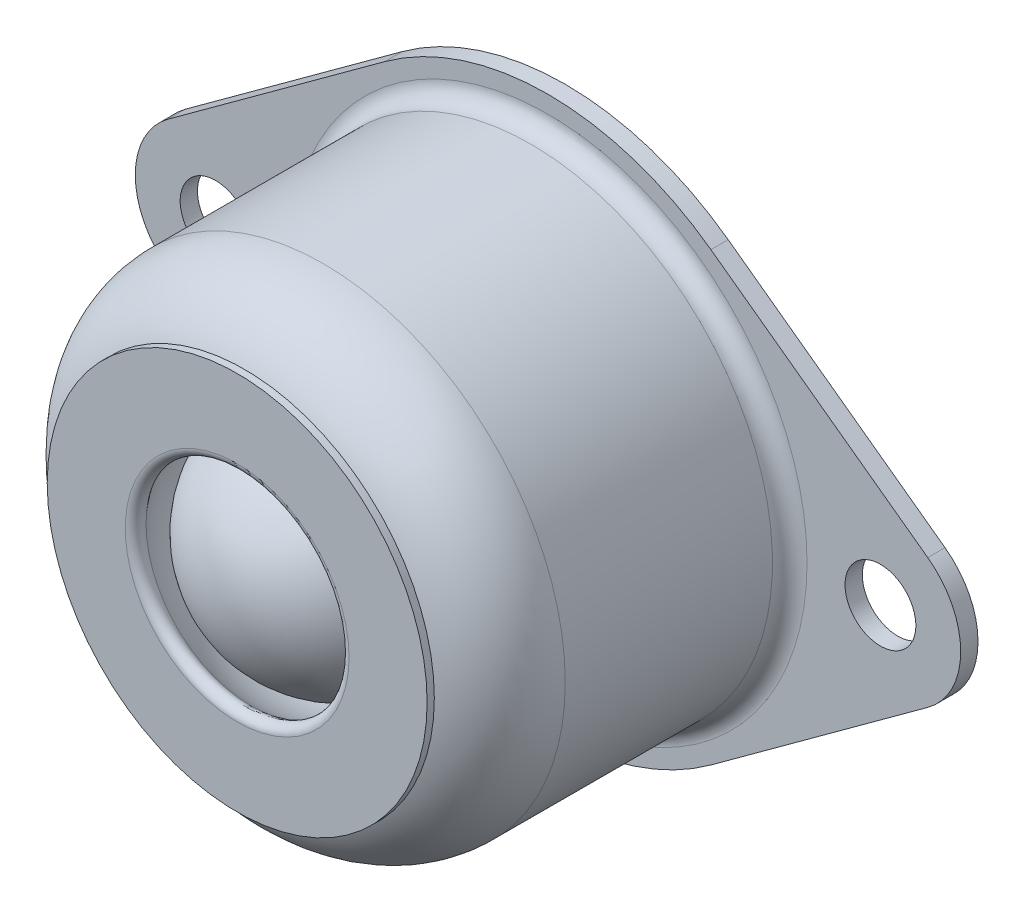
ISO-10303-21;
HEADER;
FILE_DESCRIPTION(('STEP AP214'),'2;1');
FILE_NAME('part.step','',(''),(''),'','','');
FILE_SCHEMA(('AUTOMOTIVE_DESIGN { 1 0 10303 214 1 1 1 1 }'));
ENDSEC;
DATA;
#1=APPLICATION_CONTEXT('core data for automotive mechanical design processes');
#2=APPLICATION_PROTOCOL_DEFINITION('international standard','automotive_design',2000,#1);
#3=PRODUCT_CONTEXT('',#1,'mechanical');
#4=PRODUCT('Part','Part','',(#3));
#5=PRODUCT_RELATED_PRODUCT_CATEGORY('part','',(#4));
#6=PRODUCT_DEFINITION_FORMATION('','',#4);
#7=PRODUCT_DEFINITION_CONTEXT('part definition',#1,'design');
#8=PRODUCT_DEFINITION('design','',#6,#7);
#9=PRODUCT_DEFINITION_SHAPE('','',#8);
#10=(LENGTH_UNIT() NAMED_UNIT(*) SI_UNIT(.MILLI.,.METRE.));
#11=(NAMED_UNIT(*) PLANE_ANGLE_UNIT() SI_UNIT($,.RADIAN.));
#12=(NAMED_UNIT(*) SI_UNIT($,.STERADIAN.) SOLID_ANGLE_UNIT());
#13=UNCERTAINTY_MEASURE_WITH_UNIT(LENGTH_MEASURE(1.E-05),#10,'distance_accuracy_value','');
#14=(GEOMETRIC_REPRESENTATION_CONTEXT(3) GLOBAL_UNCERTAINTY_ASSIGNED_CONTEXT((#13)) GLOBAL_UNIT_ASSIGNED_CONTEXT((#10,
#11,#12)) REPRESENTATION_CONTEXT('',''));
#15=CARTESIAN_POINT('',(0.,0.,0.));
#16=DIRECTION('',(0.,0.,1.));
#17=DIRECTION('',(1.,0.,0.));
#18=AXIS2_PLACEMENT_3D('',#15,#16,#17);
#19=CARTESIAN_POINT('',(0.,0.,13.));
#20=DIRECTION('',(0.,0.,-1.));
#21=DIRECTION('',(1.,0.,0.));
#22=AXIS2_PLACEMENT_3D('',#19,#20,#21);
#23=SPHERICAL_SURFACE('',#22,7.);
#24=CARTESIAN_POINT('',(0.,0.,6.));
#25=VERTEX_POINT('',#24);
#26=VERTEX_LOOP('',#25);
#27=FACE_BOUND('',#26,.T.);
#28=ADVANCED_FACE('F46',(#27),#23,.T.);
#29=CLOSED_SHELL('',(#28));
#30=MANIFOLD_SOLID_BREP('B2',#29);
#31=CARTESIAN_POINT('',(0.,0.,14.));
#32=DIRECTION('',(0.,0.,1.));
#33=DIRECTION('',(1.,0.,0.));
#34=AXIS2_PLACEMENT_3D('',#31,#32,#33);
#35=TOROIDAL_SURFACE('',#34,9.,5.);
#36=CARTESIAN_POINT('',(0.,0.,14.));
#37=DIRECTION('',(0.,0.,1.));
#38=DIRECTION('',(1.,0.,0.));
#39=AXIS2_PLACEMENT_3D('',#36,#37,#38);
#40=CIRCLE('',#39,14.);
#41=CARTESIAN_POINT('',(14.,0.,14.));
#42=VERTEX_POINT('',#41);
#43=EDGE_CURVE('E201',#42,#42,#40,.F.);
#44=ORIENTED_EDGE('',*,*,#43,.F.);
#45=EDGE_LOOP('',(#44));
#46=FACE_BOUND('',#45,.T.);
#47=CARTESIAN_POINT('',(0.,0.,18.5825756949558));
#48=DIRECTION('',(0.,0.,-1.));
#49=DIRECTION('',(-1.,0.,0.));
#50=AXIS2_PLACEMENT_3D('',#47,#48,#49);
#51=CIRCLE('',#50,11.);
#52=CARTESIAN_POINT('',(-11.,0.,18.5825756949558));
#53=VERTEX_POINT('',#52);
#54=EDGE_CURVE('E205',#53,#53,#51,.T.);
#55=ORIENTED_EDGE('',*,*,#54,.T.);
#56=EDGE_LOOP('',(#55));
#57=FACE_BOUND('',#56,.T.);
#58=ADVANCED_FACE('F62',(#46,#57),#35,.T.);
#59=CARTESIAN_POINT('',(0.,0.,19.));
#60=DIRECTION('',(0.,0.,-1.));
#61=DIRECTION('',(-1.,0.,0.));
#62=AXIS2_PLACEMENT_3D('',#59,#60,#61);
#63=CYLINDRICAL_SURFACE('',#62,14.);
#64=ORIENTED_EDGE('',*,*,#43,.T.);
#65=EDGE_LOOP('',(#64));
#66=FACE_BOUND('',#65,.T.);
#67=CARTESIAN_POINT('',(0.,0.,2.));
#68=DIRECTION('',(0.,0.,-1.));
#69=DIRECTION('',(-1.,0.,0.));
#70=AXIS2_PLACEMENT_3D('',#67,#68,#69);
#71=CIRCLE('',#70,14.);
#72=CARTESIAN_POINT('',(-14.,0.,2.));
#73=VERTEX_POINT('',#72);
#74=EDGE_CURVE('E198',#73,#73,#71,.F.);
#75=ORIENTED_EDGE('',*,*,#74,.T.);
#76=EDGE_LOOP('',(#75));
#77=FACE_BOUND('',#76,.T.);
#78=ADVANCED_FACE('F242',(#66,#77),#63,.T.);
#79=CARTESIAN_POINT('',(0.,0.,0.));
#80=DIRECTION('',(0.,0.,1.));
#81=DIRECTION('',(1.,0.,0.));
#82=AXIS2_PLACEMENT_3D('',#79,#80,#81);
#83=PLANE('',#82);
#84=CARTESIAN_POINT('',(0.,0.,0.));
#85=DIRECTION('',(0.,0.,1.));
#86=DIRECTION('',(1.,0.,0.));
#87=AXIS2_PLACEMENT_3D('',#84,#85,#86);
#88=CIRCLE('',#87,14.5);
#89=CARTESIAN_POINT('',(14.5,0.,0.));
#90=VERTEX_POINT('',#89);
#91=EDGE_CURVE('E44',#90,#90,#88,.T.);
#92=ORIENTED_EDGE('',*,*,#91,.T.);
#93=EDGE_LOOP('',(#92));
#94=FACE_BOUND('',#93,.T.);
#95=CARTESIAN_POINT('',(-19.25,0.,0.));
#96=DIRECTION('',(0.,0.,-1.));
#97=DIRECTION('',(1.,0.,0.));
#98=AXIS2_PLACEMENT_3D('',#95,#96,#97);
#99=CIRCLE('',#98,2.05);
#100=CARTESIAN_POINT('',(-17.2,0.,0.));
#101=VERTEX_POINT('',#100);
#102=EDGE_CURVE('E208',#101,#101,#99,.T.);
#103=ORIENTED_EDGE('',*,*,#102,.F.);
#104=EDGE_LOOP('',(#103));
#105=FACE_BOUND('',#104,.T.);
#106=CARTESIAN_POINT('',(19.25,0.,0.));
#107=DIRECTION('',(0.,0.,-1.));
#108=DIRECTION('',(-1.,0.,0.));
#109=AXIS2_PLACEMENT_3D('',#106,#107,#108);
#110=CIRCLE('',#109,2.05);
#111=CARTESIAN_POINT('',(17.2,0.,0.));
#112=VERTEX_POINT('',#111);
#113=EDGE_CURVE('E337',#112,#112,#110,.T.);
#114=ORIENTED_EDGE('',*,*,#113,.F.);
#115=EDGE_LOOP('',(#114));
#116=FACE_BOUND('',#115,.T.);
#117=CARTESIAN_POINT('',(19.25,0.,0.));
#118=DIRECTION('',(0.,0.,-1.));
#119=DIRECTION('',(-1.,0.,0.));
#120=AXIS2_PLACEMENT_3D('',#117,#118,#119);
#121=CIRCLE('',#120,4.65);
#122=CARTESIAN_POINT('',(21.9916883116883,3.75574828783183,0.));
#123=VERTEX_POINT('',#122);
#124=CARTESIAN_POINT('',(21.9916883116883,-3.75574828783183,0.));
#125=VERTEX_POINT('',#124);
#126=EDGE_CURVE('E162',#123,#125,#121,.T.);
#127=ORIENTED_EDGE('',*,*,#126,.T.);
#128=DIRECTION('',(-0.807687803834801,-0.58961038961039,0.));
#129=VECTOR('',#128,1.);
#130=CARTESIAN_POINT('',(21.9916883116883,-3.75574828783183,0.));
#131=LINE('',#130,#129);
#132=CARTESIAN_POINT('',(9.43376623376624,-12.9230048613568,0.));
#133=VERTEX_POINT('',#132);
#134=EDGE_CURVE('E165',#125,#133,#131,.T.);
#135=ORIENTED_EDGE('',*,*,#134,.T.);
#136=CARTESIAN_POINT('',(0.,0.,0.));
#137=DIRECTION('',(0.,0.,-1.));
#138=DIRECTION('',(1.,0.,0.));
#139=AXIS2_PLACEMENT_3D('',#136,#137,#138);
#140=CIRCLE('',#139,16.);
#141=CARTESIAN_POINT('',(-9.43376623376624,-12.9230048613568,0.));
#142=VERTEX_POINT('',#141);
#143=EDGE_CURVE('E169',#133,#142,#140,.T.);
#144=ORIENTED_EDGE('',*,*,#143,.T.);
#145=DIRECTION('',(-0.807687803834801,0.58961038961039,0.));
#146=VECTOR('',#145,1.);
#147=CARTESIAN_POINT('',(-21.9916883116883,-3.75574828783183,0.));
#148=LINE('',#147,#146);
#149=CARTESIAN_POINT('',(-21.9916883116883,-3.75574828783183,0.));
#150=VERTEX_POINT('',#149);
#151=EDGE_CURVE('E172',#142,#150,#148,.T.);
#152=ORIENTED_EDGE('',*,*,#151,.T.);
#153=CARTESIAN_POINT('',(-19.25,0.,0.));
#154=DIRECTION('',(0.,0.,-1.));
#155=DIRECTION('',(1.,0.,0.));
#156=AXIS2_PLACEMENT_3D('',#153,#154,#155);
#157=CIRCLE('',#156,4.65);
#158=CARTESIAN_POINT('',(-21.9916883116883,3.75574828783183,0.));
#159=VERTEX_POINT('',#158);
#160=EDGE_CURVE('E175',#150,#159,#157,.T.);
#161=ORIENTED_EDGE('',*,*,#160,.T.);
#162=DIRECTION('',(0.807687803834801,0.58961038961039,0.));
#163=VECTOR('',#162,1.);
#164=CARTESIAN_POINT('',(-21.9916883116883,3.75574828783183,0.));
#165=LINE('',#164,#163);
#166=CARTESIAN_POINT('',(-9.43376623376624,12.9230048613568,0.));
#167=VERTEX_POINT('',#166);
#168=EDGE_CURVE('E178',#159,#167,#165,.T.);
#169=ORIENTED_EDGE('',*,*,#168,.T.);
#170=CARTESIAN_POINT('',(0.,0.,0.));
#171=DIRECTION('',(0.,0.,-1.));
#172=DIRECTION('',(-1.,0.,0.));
#173=AXIS2_PLACEMENT_3D('',#170,#171,#172);
#174=CIRCLE('',#173,16.);
#175=CARTESIAN_POINT('',(9.43376623376624,12.9230048613568,0.));
#176=VERTEX_POINT('',#175);
#177=EDGE_CURVE('E139',#167,#176,#174,.T.);
#178=ORIENTED_EDGE('',*,*,#177,.T.);
#179=DIRECTION('',(0.807687803834801,-0.58961038961039,0.));
#180=VECTOR('',#179,1.);
#181=CARTESIAN_POINT('',(21.9916883116883,3.75574828783183,0.));
#182=LINE('',#181,#180);
#183=EDGE_CURVE('E181',#176,#123,#182,.T.);
#184=ORIENTED_EDGE('',*,*,#183,.T.);
#185=EDGE_LOOP('',(#127,#135,#144,#152,#161,#169,#178,#184));
#186=FACE_BOUND('',#185,.T.);
#187=ADVANCED_FACE('F249',(#94,#105,#116,#186),#83,.F.);
#188=CARTESIAN_POINT('',(19.25,0.,1.));
#189=DIRECTION('',(0.,0.,-1.));
#190=DIRECTION('',(-1.,0.,0.));
#191=AXIS2_PLACEMENT_3D('',#188,#189,#190);
#192=CYLINDRICAL_SURFACE('',#191,4.65);
#193=ORIENTED_EDGE('',*,*,#126,.F.);
#194=DIRECTION('',(0.,0.,-1.));
#195=VECTOR('',#194,1.);
#196=CARTESIAN_POINT('',(21.9916883116883,3.75574828783183,1.));
#197=LINE('',#196,#195);
#198=CARTESIAN_POINT('',(21.9916883116883,3.75574828783183,1.));
#199=VERTEX_POINT('',#198);
#200=EDGE_CURVE('E79',#199,#123,#197,.T.);
#201=ORIENTED_EDGE('',*,*,#200,.F.);
#202=CARTESIAN_POINT('',(19.25,0.,1.));
#203=DIRECTION('',(0.,0.,-1.));
#204=DIRECTION('',(-1.,0.,0.));
#205=AXIS2_PLACEMENT_3D('',#202,#203,#204);
#206=CIRCLE('',#205,4.65);
#207=CARTESIAN_POINT('',(21.9916883116883,-3.75574828783183,1.));
#208=VERTEX_POINT('',#207);
#209=EDGE_CURVE('E184',#199,#208,#206,.T.);
#210=ORIENTED_EDGE('',*,*,#209,.T.);
#211=DIRECTION('',(0.,0.,-1.));
#212=VECTOR('',#211,1.);
#213=CARTESIAN_POINT('',(21.9916883116883,-3.75574828783183,1.));
#214=LINE('',#213,#212);
#215=EDGE_CURVE('E120',#208,#125,#214,.T.);
#216=ORIENTED_EDGE('',*,*,#215,.T.);
#217=EDGE_LOOP('',(#193,#201,#210,#216));
#218=FACE_BOUND('',#217,.T.);
#219=ADVANCED_FACE('F302',(#218),#192,.T.);
#220=CARTESIAN_POINT('',(21.9916883116883,3.75574828783183,1.));
#221=DIRECTION('',(0.58961038961039,0.807687803834801,0.));
#222=DIRECTION('',(-0.807687803834801,0.58961038961039,0.));
#223=AXIS2_PLACEMENT_3D('',#220,#221,#222);
#224=PLANE('',#223);
#225=ORIENTED_EDGE('',*,*,#183,.F.);
#226=DIRECTION('',(0.,0.,-1.));
#227=VECTOR('',#226,1.);
#228=CARTESIAN_POINT('',(9.43376623376624,12.9230048613568,1.));
#229=LINE('',#228,#227);
#230=CARTESIAN_POINT('',(9.43376623376624,12.9230048613568,1.));
#231=VERTEX_POINT('',#230);
#232=EDGE_CURVE('E108',#231,#176,#229,.T.);
#233=ORIENTED_EDGE('',*,*,#232,.F.);
#234=DIRECTION('',(0.807687803834801,-0.58961038961039,0.));
#235=VECTOR('',#234,1.);
#236=CARTESIAN_POINT('',(21.9916883116883,3.75574828783183,1.));
#237=LINE('',#236,#235);
#238=EDGE_CURVE('E152',#231,#199,#237,.T.);
#239=ORIENTED_EDGE('',*,*,#238,.T.);
#240=ORIENTED_EDGE('',*,*,#200,.T.);
#241=EDGE_LOOP('',(#225,#233,#239,#240));
#242=FACE_BOUND('',#241,.T.);
#243=ADVANCED_FACE('F299',(#242),#224,.T.);
#244=CARTESIAN_POINT('',(0.,0.,1.));
#245=DIRECTION('',(0.,0.,-1.));
#246=DIRECTION('',(-1.,0.,0.));
#247=AXIS2_PLACEMENT_3D('',#244,#245,#246);
#248=CYLINDRICAL_SURFACE('',#247,16.);
#249=ORIENTED_EDGE('',*,*,#177,.F.);
#250=DIRECTION('',(0.,0.,-1.));
#251=VECTOR('',#250,1.);
#252=CARTESIAN_POINT('',(-9.43376623376624,12.9230048613568,1.));
#253=LINE('',#252,#251);
#254=CARTESIAN_POINT('',(-9.43376623376624,12.9230048613568,1.));
#255=VERTEX_POINT('',#254);
#256=EDGE_CURVE('E134',#255,#167,#253,.T.);
#257=ORIENTED_EDGE('',*,*,#256,.F.);
#258=CARTESIAN_POINT('',(0.,0.,1.));
#259=DIRECTION('',(0.,0.,-1.));
#260=DIRECTION('',(-1.,0.,0.));
#261=AXIS2_PLACEMENT_3D('',#258,#259,#260);
#262=CIRCLE('',#261,16.);
#263=EDGE_CURVE('E137',#255,#231,#262,.T.);
#264=ORIENTED_EDGE('',*,*,#263,.T.);
#265=ORIENTED_EDGE('',*,*,#232,.T.);
#266=EDGE_LOOP('',(#249,#257,#264,#265));
#267=FACE_BOUND('',#266,.T.);
#268=ADVANCED_FACE('F136',(#267),#248,.T.);
#269=CARTESIAN_POINT('',(-21.9916883116883,3.75574828783183,1.));
#270=DIRECTION('',(-0.58961038961039,0.807687803834801,0.));
#271=DIRECTION('',(-0.807687803834801,-0.58961038961039,0.));
#272=AXIS2_PLACEMENT_3D('',#269,#270,#271);
#273=PLANE('',#272);
#274=ORIENTED_EDGE('',*,*,#168,.F.);
#275=DIRECTION('',(0.,0.,-1.));
#276=VECTOR('',#275,1.);
#277=CARTESIAN_POINT('',(-21.9916883116883,3.75574828783183,1.));
#278=LINE('',#277,#276);
#279=CARTESIAN_POINT('',(-21.9916883116883,3.75574828783183,1.));
#280=VERTEX_POINT('',#279);
#281=EDGE_CURVE('E144',#280,#159,#278,.T.);
#282=ORIENTED_EDGE('',*,*,#281,.F.);
#283=DIRECTION('',(0.807687803834801,0.58961038961039,0.));
#284=VECTOR('',#283,1.);
#285=CARTESIAN_POINT('',(-21.9916883116883,3.75574828783183,1.));
#286=LINE('',#285,#284);
#287=EDGE_CURVE('E150',#280,#255,#286,.T.);
#288=ORIENTED_EDGE('',*,*,#287,.T.);
#289=ORIENTED_EDGE('',*,*,#256,.T.);
#290=EDGE_LOOP('',(#274,#282,#288,#289));
#291=FACE_BOUND('',#290,.T.);
#292=ADVANCED_FACE('F154',(#291),#273,.T.);
#293=CARTESIAN_POINT('',(-19.25,0.,1.));
#294=DIRECTION('',(0.,0.,-1.));
#295=DIRECTION('',(-1.,0.,0.));
#296=AXIS2_PLACEMENT_3D('',#293,#294,#295);
#297=CYLINDRICAL_SURFACE('',#296,4.65);
#298=ORIENTED_EDGE('',*,*,#160,.F.);
#299=DIRECTION('',(0.,0.,-1.));
#300=VECTOR('',#299,1.);
#301=CARTESIAN_POINT('',(-21.9916883116883,-3.75574828783183,1.));
#302=LINE('',#301,#300);
#303=CARTESIAN_POINT('',(-21.9916883116883,-3.75574828783183,1.));
#304=VERTEX_POINT('',#303);
#305=EDGE_CURVE('E189',#304,#150,#302,.T.);
#306=ORIENTED_EDGE('',*,*,#305,.F.);
#307=CARTESIAN_POINT('',(-19.25,0.,1.));
#308=DIRECTION('',(0.,0.,-1.));
#309=DIRECTION('',(1.,0.,0.));
#310=AXIS2_PLACEMENT_3D('',#307,#308,#309);
#311=CIRCLE('',#310,4.65);
#312=EDGE_CURVE('E155',#304,#280,#311,.T.);
#313=ORIENTED_EDGE('',*,*,#312,.T.);
#314=ORIENTED_EDGE('',*,*,#281,.T.);
#315=EDGE_LOOP('',(#298,#306,#313,#314));
#316=FACE_BOUND('',#315,.T.);
#317=ADVANCED_FACE('F307',(#316),#297,.T.);
#318=CARTESIAN_POINT('',(-21.9916883116883,-3.75574828783183,1.));
#319=DIRECTION('',(-0.58961038961039,-0.807687803834801,0.));
#320=DIRECTION('',(0.807687803834801,-0.58961038961039,0.));
#321=AXIS2_PLACEMENT_3D('',#318,#319,#320);
#322=PLANE('',#321);
#323=ORIENTED_EDGE('',*,*,#151,.F.);
#324=DIRECTION('',(0.,0.,-1.));
#325=VECTOR('',#324,1.);
#326=CARTESIAN_POINT('',(-9.43376623376624,-12.9230048613568,1.));
#327=LINE('',#326,#325);
#328=CARTESIAN_POINT('',(-9.43376623376624,-12.9230048613568,1.));
#329=VERTEX_POINT('',#328);
#330=EDGE_CURVE('E191',#329,#142,#327,.T.);
#331=ORIENTED_EDGE('',*,*,#330,.F.);
#332=DIRECTION('',(-0.807687803834801,0.58961038961039,0.));
#333=VECTOR('',#332,1.);
#334=CARTESIAN_POINT('',(-21.9916883116883,-3.75574828783183,1.));
#335=LINE('',#334,#333);
#336=EDGE_CURVE('E157',#329,#304,#335,.T.);
#337=ORIENTED_EDGE('',*,*,#336,.T.);
#338=ORIENTED_EDGE('',*,*,#305,.T.);
#339=EDGE_LOOP('',(#323,#331,#337,#338));
#340=FACE_BOUND('',#339,.T.);
#341=ADVANCED_FACE('F310',(#340),#322,.T.);
#342=CARTESIAN_POINT('',(0.,0.,1.));
#343=DIRECTION('',(0.,0.,-1.));
#344=DIRECTION('',(-1.,0.,0.));
#345=AXIS2_PLACEMENT_3D('',#342,#343,#344);
#346=CYLINDRICAL_SURFACE('',#345,16.);
#347=ORIENTED_EDGE('',*,*,#143,.F.);
#348=DIRECTION('',(0.,0.,-1.));
#349=VECTOR('',#348,1.);
#350=CARTESIAN_POINT('',(9.43376623376624,-12.9230048613568,1.));
#351=LINE('',#350,#349);
#352=CARTESIAN_POINT('',(9.43376623376624,-12.9230048613568,1.));
#353=VERTEX_POINT('',#352);
#354=EDGE_CURVE('E193',#353,#133,#351,.T.);
#355=ORIENTED_EDGE('',*,*,#354,.F.);
#356=CARTESIAN_POINT('',(0.,0.,1.));
#357=DIRECTION('',(0.,0.,-1.));
#358=DIRECTION('',(1.,0.,0.));
#359=AXIS2_PLACEMENT_3D('',#356,#357,#358);
#360=CIRCLE('',#359,16.);
#361=EDGE_CURVE('E346',#353,#329,#360,.T.);
#362=ORIENTED_EDGE('',*,*,#361,.T.);
#363=ORIENTED_EDGE('',*,*,#330,.T.);
#364=EDGE_LOOP('',(#347,#355,#362,#363));
#365=FACE_BOUND('',#364,.T.);
#366=ADVANCED_FACE('F314',(#365),#346,.T.);
#367=CARTESIAN_POINT('',(21.9916883116883,-3.75574828783183,1.));
#368=DIRECTION('',(0.58961038961039,-0.807687803834801,0.));
#369=DIRECTION('',(0.807687803834801,0.58961038961039,0.));
#370=AXIS2_PLACEMENT_3D('',#367,#368,#369);
#371=PLANE('',#370);
#372=ORIENTED_EDGE('',*,*,#134,.F.);
#373=ORIENTED_EDGE('',*,*,#215,.F.);
#374=DIRECTION('',(-0.807687803834801,-0.58961038961039,0.));
#375=VECTOR('',#374,1.);
#376=CARTESIAN_POINT('',(21.9916883116883,-3.75574828783183,1.));
#377=LINE('',#376,#375);
#378=EDGE_CURVE('E339',#208,#353,#377,.T.);
#379=ORIENTED_EDGE('',*,*,#378,.T.);
#380=ORIENTED_EDGE('',*,*,#354,.T.);
#381=EDGE_LOOP('',(#372,#373,#379,#380));
#382=FACE_BOUND('',#381,.T.);
#383=ADVANCED_FACE('F297',(#382),#371,.T.);
#384=CARTESIAN_POINT('',(19.25,0.,1.));
#385=DIRECTION('',(0.,0.,-1.));
#386=DIRECTION('',(-1.,0.,0.));
#387=AXIS2_PLACEMENT_3D('',#384,#385,#386);
#388=PLANE('',#387);
#389=CARTESIAN_POINT('',(0.,0.,1.));
#390=DIRECTION('',(0.,0.,-1.));
#391=DIRECTION('',(-1.,0.,0.));
#392=AXIS2_PLACEMENT_3D('',#389,#390,#391);
#393=CIRCLE('',#392,15.);
#394=CARTESIAN_POINT('',(-15.,0.,1.));
#395=VERTEX_POINT('',#394);
#396=EDGE_CURVE('E186',#395,#395,#393,.T.);
#397=ORIENTED_EDGE('',*,*,#396,.T.);
#398=EDGE_LOOP('',(#397));
#399=FACE_BOUND('',#398,.T.);
#400=CARTESIAN_POINT('',(-19.25,0.,1.));
#401=DIRECTION('',(0.,0.,-1.));
#402=DIRECTION('',(1.,0.,0.));
#403=AXIS2_PLACEMENT_3D('',#400,#401,#402);
#404=CIRCLE('',#403,2.05);
#405=CARTESIAN_POINT('',(-17.2,0.,1.));
#406=VERTEX_POINT('',#405);
#407=EDGE_CURVE('E352',#406,#406,#404,.T.);
#408=ORIENTED_EDGE('',*,*,#407,.T.);
#409=EDGE_LOOP('',(#408));
#410=FACE_BOUND('',#409,.T.);
#411=CARTESIAN_POINT('',(19.25,0.,1.));
#412=DIRECTION('',(0.,0.,-1.));
#413=DIRECTION('',(-1.,0.,0.));
#414=AXIS2_PLACEMENT_3D('',#411,#412,#413);
#415=CIRCLE('',#414,2.05);
#416=CARTESIAN_POINT('',(17.2,0.,1.));
#417=VERTEX_POINT('',#416);
#418=EDGE_CURVE('E166',#417,#417,#415,.T.);
#419=ORIENTED_EDGE('',*,*,#418,.T.);
#420=EDGE_LOOP('',(#419));
#421=FACE_BOUND('',#420,.T.);
#422=ORIENTED_EDGE('',*,*,#209,.F.);
#423=ORIENTED_EDGE('',*,*,#238,.F.);
#424=ORIENTED_EDGE('',*,*,#263,.F.);
#425=ORIENTED_EDGE('',*,*,#287,.F.);
#426=ORIENTED_EDGE('',*,*,#312,.F.);
#427=ORIENTED_EDGE('',*,*,#336,.F.);
#428=ORIENTED_EDGE('',*,*,#361,.F.);
#429=ORIENTED_EDGE('',*,*,#378,.F.);
#430=EDGE_LOOP('',(#422,#423,#424,#425,#426,#427,#428,#429));
#431=FACE_BOUND('',#430,.T.);
#432=ADVANCED_FACE('F148',(#399,#410,#421,#431),#388,.F.);
#433=CARTESIAN_POINT('',(19.25,0.,1.));
#434=DIRECTION('',(0.,0.,-1.));
#435=DIRECTION('',(-1.,0.,0.));
#436=AXIS2_PLACEMENT_3D('',#433,#434,#435);
#437=CYLINDRICAL_SURFACE('',#436,2.05);
#438=ORIENTED_EDGE('',*,*,#418,.F.);
#439=EDGE_LOOP('',(#438));
#440=FACE_BOUND('',#439,.T.);
#441=ORIENTED_EDGE('',*,*,#113,.T.);
#442=EDGE_LOOP('',(#441));
#443=FACE_BOUND('',#442,.T.);
#444=ADVANCED_FACE('F290',(#440,#443),#437,.F.);
#445=CARTESIAN_POINT('',(-19.25,0.,1.));
#446=DIRECTION('',(0.,0.,-1.));
#447=DIRECTION('',(-1.,0.,0.));
#448=AXIS2_PLACEMENT_3D('',#445,#446,#447);
#449=CYLINDRICAL_SURFACE('',#448,2.05);
#450=ORIENTED_EDGE('',*,*,#407,.F.);
#451=EDGE_LOOP('',(#450));
#452=FACE_BOUND('',#451,.T.);
#453=ORIENTED_EDGE('',*,*,#102,.T.);
#454=EDGE_LOOP('',(#453));
#455=FACE_BOUND('',#454,.T.);
#456=ADVANCED_FACE('F287',(#452,#455),#449,.F.);
#457=CARTESIAN_POINT('',(0.,0.,2.));
#458=DIRECTION('',(0.,0.,-1.));
#459=DIRECTION('',(-1.,0.,0.));
#460=AXIS2_PLACEMENT_3D('',#457,#458,#459);
#461=TOROIDAL_SURFACE('',#460,15.,1.);
#462=ORIENTED_EDGE('',*,*,#74,.F.);
#463=EDGE_LOOP('',(#462));
#464=FACE_BOUND('',#463,.T.);
#465=ORIENTED_EDGE('',*,*,#396,.F.);
#466=EDGE_LOOP('',(#465));
#467=FACE_BOUND('',#466,.T.);
#468=ADVANCED_FACE('F256',(#464,#467),#461,.F.);
#469=CARTESIAN_POINT('',(0.,0.,8.8));
#470=DIRECTION('',(0.,0.,-1.));
#471=DIRECTION('',(-1.,0.,0.));
#472=AXIS2_PLACEMENT_3D('',#469,#470,#471);
#473=CYLINDRICAL_SURFACE('',#472,12.5);
#474=CARTESIAN_POINT('',(0.,0.,2.));
#475=DIRECTION('',(0.,0.,1.));
#476=DIRECTION('',(1.,0.,0.));
#477=AXIS2_PLACEMENT_3D('',#474,#475,#476);
#478=CIRCLE('',#477,12.5);
#479=CARTESIAN_POINT('',(12.5,0.,2.));
#480=VERTEX_POINT('',#479);
#481=EDGE_CURVE('E71',#480,#480,#478,.F.);
#482=ORIENTED_EDGE('',*,*,#481,.T.);
#483=EDGE_LOOP('',(#482));
#484=FACE_BOUND('',#483,.T.);
#485=CARTESIAN_POINT('',(0.,0.,7.8));
#486=DIRECTION('',(0.,0.,-1.));
#487=DIRECTION('',(-1.,0.,0.));
#488=AXIS2_PLACEMENT_3D('',#485,#486,#487);
#489=CIRCLE('',#488,12.5);
#490=CARTESIAN_POINT('',(-12.5,0.,7.8));
#491=VERTEX_POINT('',#490);
#492=EDGE_CURVE('E224',#491,#491,#489,.F.);
#493=ORIENTED_EDGE('',*,*,#492,.T.);
#494=EDGE_LOOP('',(#493));
#495=FACE_BOUND('',#494,.T.);
#496=ADVANCED_FACE('F229',(#484,#495),#473,.F.);
#497=CARTESIAN_POINT('',(0.,0.,8.8));
#498=DIRECTION('',(0.,0.,-1.));
#499=DIRECTION('',(-1.,0.,0.));
#500=AXIS2_PLACEMENT_3D('',#497,#498,#499);
#501=PLANE('',#500);
#502=CARTESIAN_POINT('',(0.,0.,8.8));
#503=DIRECTION('',(0.,0.,-1.));
#504=DIRECTION('',(-1.,0.,0.));
#505=AXIS2_PLACEMENT_3D('',#502,#503,#504);
#506=CIRCLE('',#505,10.8148046676766);
#507=CARTESIAN_POINT('',(-10.8148046676766,0.,8.8));
#508=VERTEX_POINT('',#507);
#509=EDGE_CURVE('E218',#508,#508,#506,.F.);
#510=ORIENTED_EDGE('',*,*,#509,.T.);
#511=EDGE_LOOP('',(#510));
#512=FACE_BOUND('',#511,.T.);
#513=CARTESIAN_POINT('',(0.,0.,8.8));
#514=DIRECTION('',(0.,0.,-1.));
#515=DIRECTION('',(-1.,0.,0.));
#516=AXIS2_PLACEMENT_3D('',#513,#514,#515);
#517=CIRCLE('',#516,11.5);
#518=CARTESIAN_POINT('',(-11.5,0.,8.8));
#519=VERTEX_POINT('',#518);
#520=EDGE_CURVE('E215',#519,#519,#517,.T.);
#521=ORIENTED_EDGE('',*,*,#520,.T.);
#522=EDGE_LOOP('',(#521));
#523=FACE_BOUND('',#522,.T.);
#524=ADVANCED_FACE('F270',(#512,#523),#501,.T.);
#525=CARTESIAN_POINT('',(0.,0.,13.));
#526=DIRECTION('',(0.,0.,-1.));
#527=DIRECTION('',(1.,0.,0.));
#528=AXIS2_PLACEMENT_3D('',#525,#526,#527);
#529=SPHERICAL_SURFACE('',#528,11.);
#530=CARTESIAN_POINT('',(0.,0.,8.23333333333333));
#531=DIRECTION('',(0.,0.,1.));
#532=DIRECTION('',(1.,0.,0.));
#533=AXIS2_PLACEMENT_3D('',#530,#531,#532);
#534=CIRCLE('',#533,9.91357094537024);
#535=CARTESIAN_POINT('',(9.91357094537024,0.,8.23333333333333));
#536=VERTEX_POINT('',#535);
#537=EDGE_CURVE('E221',#536,#536,#534,.F.);
#538=ORIENTED_EDGE('',*,*,#537,.T.);
#539=EDGE_LOOP('',(#538));
#540=FACE_BOUND('',#539,.T.);
#541=ADVANCED_FACE('F273',(#540),#529,.T.);
#542=CARTESIAN_POINT('',(0.,0.,2.));
#543=DIRECTION('',(0.,0.,-1.));
#544=DIRECTION('',(-1.,0.,0.));
#545=AXIS2_PLACEMENT_3D('',#542,#543,#544);
#546=CYLINDRICAL_SURFACE('',#545,11.);
#547=ORIENTED_EDGE('',*,*,#54,.F.);
#548=EDGE_LOOP('',(#547));
#549=FACE_BOUND('',#548,.T.);
#550=CARTESIAN_POINT('',(0.,0.,19.));
#551=DIRECTION('',(0.,0.,-1.));
#552=DIRECTION('',(-1.,0.,0.));
#553=AXIS2_PLACEMENT_3D('',#550,#551,#552);
#554=CIRCLE('',#553,11.);
#555=CARTESIAN_POINT('',(-11.,0.,19.));
#556=VERTEX_POINT('',#555);
#557=EDGE_CURVE('E209',#556,#556,#554,.T.);
#558=ORIENTED_EDGE('',*,*,#557,.T.);
#559=EDGE_LOOP('',(#558));
#560=FACE_BOUND('',#559,.T.);
#561=ADVANCED_FACE('F281',(#549,#560),#546,.T.);
#562=CARTESIAN_POINT('',(0.,0.,19.));
#563=DIRECTION('',(0.,0.,1.));
#564=DIRECTION('',(1.,0.,0.));
#565=AXIS2_PLACEMENT_3D('',#562,#563,#564);
#566=PLANE('',#565);
#567=CARTESIAN_POINT('',(0.,0.,19.));
#568=DIRECTION('',(0.,0.,1.));
#569=DIRECTION('',(1.,0.,0.));
#570=AXIS2_PLACEMENT_3D('',#567,#568,#569);
#571=CIRCLE('',#570,6.48074069840786);
#572=CARTESIAN_POINT('',(6.48074069840786,0.,19.));
#573=VERTEX_POINT('',#572);
#574=EDGE_CURVE('E204',#573,#573,#571,.F.);
#575=ORIENTED_EDGE('',*,*,#574,.T.);
#576=EDGE_LOOP('',(#575));
#577=FACE_BOUND('',#576,.T.);
#578=ORIENTED_EDGE('',*,*,#557,.F.);
#579=EDGE_LOOP('',(#578));
#580=FACE_BOUND('',#579,.T.);
#581=ADVANCED_FACE('F323',(#577,#580),#566,.T.);
#582=CARTESIAN_POINT('',(0.,0.,13.));
#583=DIRECTION('',(0.,0.,-1.));
#584=DIRECTION('',(1.,0.,0.));
#585=AXIS2_PLACEMENT_3D('',#582,#583,#584);
#586=SPHERICAL_SURFACE('',#585,8.);
#587=CARTESIAN_POINT('',(0.,0.,18.1764705882353));
#588=DIRECTION('',(0.,0.,-1.));
#589=DIRECTION('',(-1.,0.,0.));
#590=AXIS2_PLACEMENT_3D('',#587,#588,#589);
#591=CIRCLE('',#590,6.09952065732505);
#592=CARTESIAN_POINT('',(-6.09952065732504,0.,18.1764705882353));
#593=VERTEX_POINT('',#592);
#594=EDGE_CURVE('E212',#593,#593,#591,.F.);
#595=ORIENTED_EDGE('',*,*,#594,.T.);
#596=EDGE_LOOP('',(#595));
#597=FACE_BOUND('',#596,.T.);
#598=ADVANCED_FACE('F260',(#597),#586,.F.);
#599=CARTESIAN_POINT('',(0.,0.,18.5));
#600=DIRECTION('',(0.,0.,1.));
#601=DIRECTION('',(1.,0.,0.));
#602=AXIS2_PLACEMENT_3D('',#599,#600,#601);
#603=TOROIDAL_SURFACE('',#602,6.48074069840786,0.5);
#604=ORIENTED_EDGE('',*,*,#594,.F.);
#605=EDGE_LOOP('',(#604));
#606=FACE_BOUND('',#605,.T.);
#607=ORIENTED_EDGE('',*,*,#574,.F.);
#608=EDGE_LOOP('',(#607));
#609=FACE_BOUND('',#608,.T.);
#610=ADVANCED_FACE('F257',(#606,#609),#603,.T.);
#611=CARTESIAN_POINT('',(0.,0.,7.8));
#612=DIRECTION('',(0.,0.,-1.));
#613=DIRECTION('',(-1.,0.,0.));
#614=AXIS2_PLACEMENT_3D('',#611,#612,#613);
#615=TOROIDAL_SURFACE('',#614,10.8148046676766,1.);
#616=ORIENTED_EDGE('',*,*,#537,.F.);
#617=EDGE_LOOP('',(#616));
#618=FACE_BOUND('',#617,.T.);
#619=ORIENTED_EDGE('',*,*,#509,.F.);
#620=EDGE_LOOP('',(#619));
#621=FACE_BOUND('',#620,.T.);
#622=ADVANCED_FACE('F238',(#618,#621),#615,.F.);
#623=CARTESIAN_POINT('',(0.,0.,7.8));
#624=DIRECTION('',(0.,0.,-1.));
#625=DIRECTION('',(-1.,0.,0.));
#626=AXIS2_PLACEMENT_3D('',#623,#624,#625);
#627=TOROIDAL_SURFACE('',#626,11.5,1.);
#628=ORIENTED_EDGE('',*,*,#492,.F.);
#629=EDGE_LOOP('',(#628));
#630=FACE_BOUND('',#629,.T.);
#631=ORIENTED_EDGE('',*,*,#520,.F.);
#632=EDGE_LOOP('',(#631));
#633=FACE_BOUND('',#632,.T.);
#634=ADVANCED_FACE('F233',(#630,#633),#627,.F.);
#635=CARTESIAN_POINT('',(0.,0.,2.));
#636=DIRECTION('',(0.,0.,1.));
#637=DIRECTION('',(1.,0.,0.));
#638=AXIS2_PLACEMENT_3D('',#635,#636,#637);
#639=TOROIDAL_SURFACE('',#638,14.5,2.);
#640=ORIENTED_EDGE('',*,*,#91,.F.);
#641=EDGE_LOOP('',(#640));
#642=FACE_BOUND('',#641,.T.);
#643=ORIENTED_EDGE('',*,*,#481,.F.);
#644=EDGE_LOOP('',(#643));
#645=FACE_BOUND('',#644,.T.);
#646=ADVANCED_FACE('F64',(#642,#645),#639,.T.);
#647=CLOSED_SHELL('',(#58,#78,#187,#219,#243,#268,#292,#317,#341,#366,#383,#432,#444,#456,#468,
#496,#524,#541,#561,#581,#598,#610,#622,#634,#646));
#648=MANIFOLD_SOLID_BREP('B6',#647);
#649=ADVANCED_BREP_SHAPE_REPRESENTATION('',(#18,#30,#648),#14);
#650=SHAPE_DEFINITION_REPRESENTATION(#9,#649);
ENDSEC;
END-ISO-10303-21;
